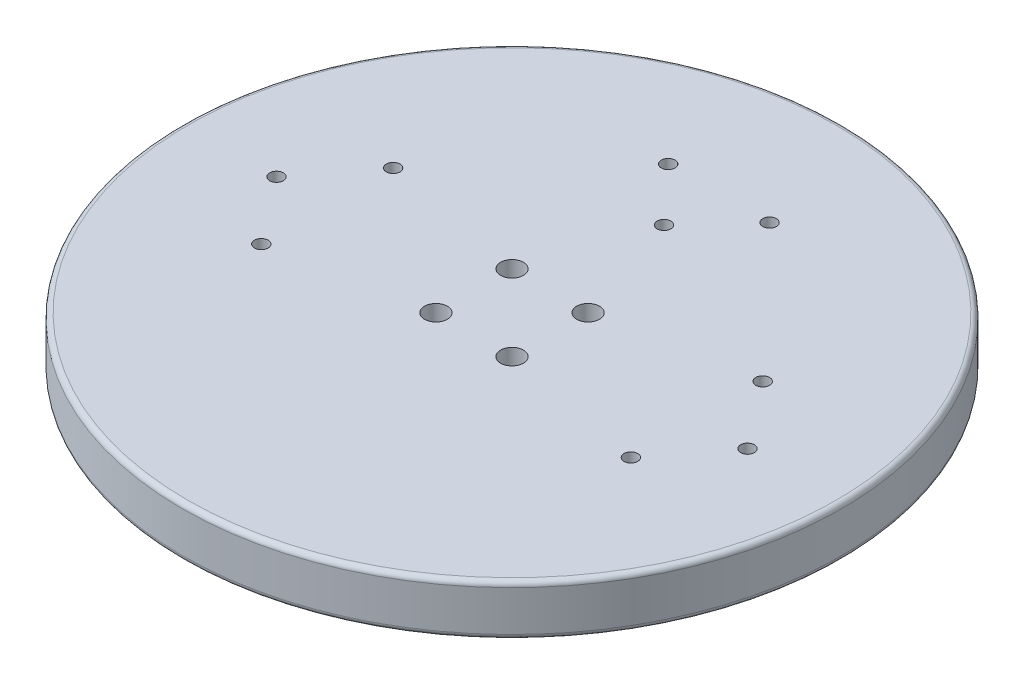
ISO-10303-21;
HEADER;
FILE_DESCRIPTION(('STEP AP214'),'2;1');
FILE_NAME('part.step','',(''),(''),'','','');
FILE_SCHEMA(('AUTOMOTIVE_DESIGN { 1 0 10303 214 1 1 1 1 }'));
ENDSEC;
DATA;
#1=APPLICATION_CONTEXT('core data for automotive mechanical design processes');
#2=APPLICATION_PROTOCOL_DEFINITION('international standard','automotive_design',2000,#1);
#3=PRODUCT_CONTEXT('',#1,'mechanical');
#4=PRODUCT('Part','Part','',(#3));
#5=PRODUCT_RELATED_PRODUCT_CATEGORY('part','',(#4));
#6=PRODUCT_DEFINITION_FORMATION('','',#4);
#7=PRODUCT_DEFINITION_CONTEXT('part definition',#1,'design');
#8=PRODUCT_DEFINITION('design','',#6,#7);
#9=PRODUCT_DEFINITION_SHAPE('','',#8);
#10=(LENGTH_UNIT() NAMED_UNIT(*) SI_UNIT(.MILLI.,.METRE.));
#11=(NAMED_UNIT(*) PLANE_ANGLE_UNIT() SI_UNIT($,.RADIAN.));
#12=(NAMED_UNIT(*) SI_UNIT($,.STERADIAN.) SOLID_ANGLE_UNIT());
#13=UNCERTAINTY_MEASURE_WITH_UNIT(LENGTH_MEASURE(1.E-05),#10,'distance_accuracy_value','');
#14=(GEOMETRIC_REPRESENTATION_CONTEXT(3) GLOBAL_UNCERTAINTY_ASSIGNED_CONTEXT((#13)) GLOBAL_UNIT_ASSIGNED_CONTEXT((#10,
#11,#12)) REPRESENTATION_CONTEXT('',''));
#15=CARTESIAN_POINT('',(0.,0.,0.));
#16=DIRECTION('',(0.,0.,1.));
#17=DIRECTION('',(1.,0.,0.));
#18=AXIS2_PLACEMENT_3D('',#15,#16,#17);
#19=CARTESIAN_POINT('',(0.,10.,0.));
#20=DIRECTION('',(0.,-1.,0.));
#21=DIRECTION('',(0.,0.,-1.));
#22=AXIS2_PLACEMENT_3D('',#19,#20,#21);
#23=CYLINDRICAL_SURFACE('',#22,65.);
#24=CARTESIAN_POINT('',(0.,0.999999999999999,0.));
#25=DIRECTION('',(0.,1.,0.));
#26=DIRECTION('',(0.,0.,1.));
#27=AXIS2_PLACEMENT_3D('',#24,#25,#26);
#28=CIRCLE('',#27,65.);
#29=CARTESIAN_POINT('',(0.,0.999999999999999,65.));
#30=VERTEX_POINT('',#29);
#31=EDGE_CURVE('E43',#30,#30,#28,.T.);
#32=ORIENTED_EDGE('',*,*,#31,.T.);
#33=EDGE_LOOP('',(#32));
#34=FACE_BOUND('',#33,.T.);
#35=CARTESIAN_POINT('',(0.,9.,0.));
#36=DIRECTION('',(0.,1.,0.));
#37=DIRECTION('',(0.,0.,1.));
#38=AXIS2_PLACEMENT_3D('',#35,#36,#37);
#39=CIRCLE('',#38,65.);
#40=CARTESIAN_POINT('',(0.,9.,65.));
#41=VERTEX_POINT('',#40);
#42=EDGE_CURVE('E47',#41,#41,#39,.F.);
#43=ORIENTED_EDGE('',*,*,#42,.T.);
#44=EDGE_LOOP('',(#43));
#45=FACE_BOUND('',#44,.T.);
#46=ADVANCED_FACE('F32',(#34,#45),#23,.T.);
#47=CARTESIAN_POINT('',(0.,10.,0.));
#48=DIRECTION('',(0.,1.,0.));
#49=DIRECTION('',(0.,0.,1.));
#50=AXIS2_PLACEMENT_3D('',#47,#48,#49);
#51=PLANE('',#50);
#52=CARTESIAN_POINT('',(-7.5,10.,7.5));
#53=DIRECTION('',(0.,-1.,0.));
#54=DIRECTION('',(0.,0.,-1.));
#55=AXIS2_PLACEMENT_3D('',#52,#53,#54);
#56=CIRCLE('',#55,2.2479);
#57=CARTESIAN_POINT('',(-7.5,10.,5.2521));
#58=VERTEX_POINT('',#57);
#59=EDGE_CURVE('E124',#58,#58,#56,.T.);
#60=ORIENTED_EDGE('',*,*,#59,.T.);
#61=EDGE_LOOP('',(#60));
#62=FACE_BOUND('',#61,.T.);
#63=CARTESIAN_POINT('',(7.5,10.,7.5));
#64=DIRECTION('',(0.,-1.,0.));
#65=DIRECTION('',(0.,0.,-1.));
#66=AXIS2_PLACEMENT_3D('',#63,#64,#65);
#67=CIRCLE('',#66,2.2479);
#68=CARTESIAN_POINT('',(7.5,10.,5.2521));
#69=VERTEX_POINT('',#68);
#70=EDGE_CURVE('E118',#69,#69,#67,.T.);
#71=ORIENTED_EDGE('',*,*,#70,.T.);
#72=EDGE_LOOP('',(#71));
#73=FACE_BOUND('',#72,.T.);
#74=CARTESIAN_POINT('',(-7.5,10.,-7.5));
#75=DIRECTION('',(0.,-1.,0.));
#76=DIRECTION('',(0.,0.,-1.));
#77=AXIS2_PLACEMENT_3D('',#74,#75,#76);
#78=CIRCLE('',#77,2.2479);
#79=CARTESIAN_POINT('',(-7.5,10.,-9.7479));
#80=VERTEX_POINT('',#79);
#81=EDGE_CURVE('E112',#80,#80,#78,.T.);
#82=ORIENTED_EDGE('',*,*,#81,.T.);
#83=EDGE_LOOP('',(#82));
#84=FACE_BOUND('',#83,.T.);
#85=CARTESIAN_POINT('',(7.5,10.,-7.5));
#86=DIRECTION('',(0.,-1.,0.));
#87=DIRECTION('',(0.,0.,-1.));
#88=AXIS2_PLACEMENT_3D('',#85,#86,#87);
#89=CIRCLE('',#88,2.2479);
#90=CARTESIAN_POINT('',(7.5,10.,-9.7479));
#91=VERTEX_POINT('',#90);
#92=EDGE_CURVE('E106',#91,#91,#89,.T.);
#93=ORIENTED_EDGE('',*,*,#92,.T.);
#94=EDGE_LOOP('',(#93));
#95=FACE_BOUND('',#94,.T.);
#96=CARTESIAN_POINT('',(-46.445,10.,0.));
#97=DIRECTION('',(0.,-1.,0.));
#98=DIRECTION('',(0.,0.,-1.));
#99=AXIS2_PLACEMENT_3D('',#96,#97,#98);
#100=CIRCLE('',#99,1.35254999999999);
#101=CARTESIAN_POINT('',(-46.445,10.,-1.35254999999999));
#102=VERTEX_POINT('',#101);
#103=EDGE_CURVE('E100',#102,#102,#100,.T.);
#104=ORIENTED_EDGE('',*,*,#103,.T.);
#105=EDGE_LOOP('',(#104));
#106=FACE_BOUND('',#105,.T.);
#107=CARTESIAN_POINT('',(46.445,10.,0.));
#108=DIRECTION('',(0.,-1.,0.));
#109=DIRECTION('',(0.,0.,-1.));
#110=AXIS2_PLACEMENT_3D('',#107,#108,#109);
#111=CIRCLE('',#110,1.35254999999999);
#112=CARTESIAN_POINT('',(46.445,10.,-1.35254999999999));
#113=VERTEX_POINT('',#112);
#114=EDGE_CURVE('E94',#113,#113,#111,.T.);
#115=ORIENTED_EDGE('',*,*,#114,.T.);
#116=EDGE_LOOP('',(#115));
#117=FACE_BOUND('',#116,.T.);
#118=CARTESIAN_POINT('',(-36.445,10.,-13.));
#119=DIRECTION('',(0.,-1.,0.));
#120=DIRECTION('',(0.,0.,-1.));
#121=AXIS2_PLACEMENT_3D('',#118,#119,#120);
#122=CIRCLE('',#121,1.35254999999999);
#123=CARTESIAN_POINT('',(-36.445,10.,-14.35255));
#124=VERTEX_POINT('',#123);
#125=EDGE_CURVE('E88',#124,#124,#122,.T.);
#126=ORIENTED_EDGE('',*,*,#125,.T.);
#127=EDGE_LOOP('',(#126));
#128=FACE_BOUND('',#127,.T.);
#129=CARTESIAN_POINT('',(-36.445,10.,13.));
#130=DIRECTION('',(0.,-1.,0.));
#131=DIRECTION('',(0.,0.,-1.));
#132=AXIS2_PLACEMENT_3D('',#129,#130,#131);
#133=CIRCLE('',#132,1.35254999999999);
#134=CARTESIAN_POINT('',(-36.445,10.,11.64745));
#135=VERTEX_POINT('',#134);
#136=EDGE_CURVE('E82',#135,#135,#133,.T.);
#137=ORIENTED_EDGE('',*,*,#136,.T.);
#138=EDGE_LOOP('',(#137));
#139=FACE_BOUND('',#138,.T.);
#140=CARTESIAN_POINT('',(36.445,10.,13.));
#141=DIRECTION('',(0.,-1.,0.));
#142=DIRECTION('',(0.,0.,-1.));
#143=AXIS2_PLACEMENT_3D('',#140,#141,#142);
#144=CIRCLE('',#143,1.35254999999999);
#145=CARTESIAN_POINT('',(36.445,10.,11.64745));
#146=VERTEX_POINT('',#145);
#147=EDGE_CURVE('E76',#146,#146,#144,.T.);
#148=ORIENTED_EDGE('',*,*,#147,.T.);
#149=EDGE_LOOP('',(#148));
#150=FACE_BOUND('',#149,.T.);
#151=CARTESIAN_POINT('',(36.445,10.,-13.));
#152=DIRECTION('',(0.,-1.,0.));
#153=DIRECTION('',(0.,0.,-1.));
#154=AXIS2_PLACEMENT_3D('',#151,#152,#153);
#155=CIRCLE('',#154,1.35254999999999);
#156=CARTESIAN_POINT('',(36.445,10.,-14.35255));
#157=VERTEX_POINT('',#156);
#158=EDGE_CURVE('E70',#157,#157,#155,.T.);
#159=ORIENTED_EDGE('',*,*,#158,.T.);
#160=EDGE_LOOP('',(#159));
#161=FACE_BOUND('',#160,.T.);
#162=CARTESIAN_POINT('',(10.0011944901924,10.,-40.8000000000147));
#163=DIRECTION('',(0.,-1.,0.));
#164=DIRECTION('',(0.,0.,-1.));
#165=AXIS2_PLACEMENT_3D('',#162,#163,#164);
#166=CIRCLE('',#165,1.35255);
#167=CARTESIAN_POINT('',(10.0011944901924,10.,-42.1525500000146));
#168=VERTEX_POINT('',#167);
#169=EDGE_CURVE('E64',#168,#168,#166,.T.);
#170=ORIENTED_EDGE('',*,*,#169,.T.);
#171=EDGE_LOOP('',(#170));
#172=FACE_BOUND('',#171,.T.);
#173=CARTESIAN_POINT('',(0.00119449019234531,10.,-29.9780972451109));
#174=DIRECTION('',(0.,-1.,0.));
#175=DIRECTION('',(0.,0.,-1.));
#176=AXIS2_PLACEMENT_3D('',#173,#174,#175);
#177=CIRCLE('',#176,1.35255);
#178=CARTESIAN_POINT('',(0.00119449019234531,10.,-31.3306472451109));
#179=VERTEX_POINT('',#178);
#180=EDGE_CURVE('E58',#179,#179,#177,.T.);
#181=ORIENTED_EDGE('',*,*,#180,.T.);
#182=EDGE_LOOP('',(#181));
#183=FACE_BOUND('',#182,.T.);
#184=CARTESIAN_POINT('',(-9.9988055098076,10.,-40.8000000000147));
#185=DIRECTION('',(0.,-1.,0.));
#186=DIRECTION('',(0.,0.,-1.));
#187=AXIS2_PLACEMENT_3D('',#184,#185,#186);
#188=CIRCLE('',#187,1.35255);
#189=CARTESIAN_POINT('',(-9.9988055098076,10.,-42.1525500000147));
#190=VERTEX_POINT('',#189);
#191=EDGE_CURVE('E52',#190,#190,#188,.T.);
#192=ORIENTED_EDGE('',*,*,#191,.T.);
#193=EDGE_LOOP('',(#192));
#194=FACE_BOUND('',#193,.T.);
#195=CARTESIAN_POINT('',(0.,10.,0.));
#196=DIRECTION('',(0.,1.,0.));
#197=DIRECTION('',(0.,0.,1.));
#198=AXIS2_PLACEMENT_3D('',#195,#196,#197);
#199=CIRCLE('',#198,64.);
#200=CARTESIAN_POINT('',(0.,10.,64.));
#201=VERTEX_POINT('',#200);
#202=EDGE_CURVE('E10',#201,#201,#199,.T.);
#203=ORIENTED_EDGE('',*,*,#202,.T.);
#204=EDGE_LOOP('',(#203));
#205=FACE_BOUND('',#204,.T.);
#206=ADVANCED_FACE('F137',(#62,#73,#84,#95,#106,#117,#128,#139,#150,#161,#172,#183,#194,#205),
#51,.T.);
#207=CARTESIAN_POINT('',(0.,0.,0.));
#208=DIRECTION('',(0.,1.,0.));
#209=DIRECTION('',(0.,0.,1.));
#210=AXIS2_PLACEMENT_3D('',#207,#208,#209);
#211=PLANE('',#210);
#212=CARTESIAN_POINT('',(-7.5,0.,7.5));
#213=DIRECTION('',(0.,-1.,0.));
#214=DIRECTION('',(0.,0.,-1.));
#215=AXIS2_PLACEMENT_3D('',#212,#213,#214);
#216=CIRCLE('',#215,2.2479);
#217=CARTESIAN_POINT('',(-7.5,0.,5.2521));
#218=VERTEX_POINT('',#217);
#219=EDGE_CURVE('E127',#218,#218,#216,.T.);
#220=ORIENTED_EDGE('',*,*,#219,.F.);
#221=EDGE_LOOP('',(#220));
#222=FACE_BOUND('',#221,.T.);
#223=CARTESIAN_POINT('',(7.5,0.,7.5));
#224=DIRECTION('',(0.,-1.,0.));
#225=DIRECTION('',(0.,0.,-1.));
#226=AXIS2_PLACEMENT_3D('',#223,#224,#225);
#227=CIRCLE('',#226,2.2479);
#228=CARTESIAN_POINT('',(7.5,0.,5.2521));
#229=VERTEX_POINT('',#228);
#230=EDGE_CURVE('E121',#229,#229,#227,.T.);
#231=ORIENTED_EDGE('',*,*,#230,.F.);
#232=EDGE_LOOP('',(#231));
#233=FACE_BOUND('',#232,.T.);
#234=CARTESIAN_POINT('',(-7.5,0.,-7.5));
#235=DIRECTION('',(0.,-1.,0.));
#236=DIRECTION('',(0.,0.,-1.));
#237=AXIS2_PLACEMENT_3D('',#234,#235,#236);
#238=CIRCLE('',#237,2.2479);
#239=CARTESIAN_POINT('',(-7.5,0.,-9.7479));
#240=VERTEX_POINT('',#239);
#241=EDGE_CURVE('E115',#240,#240,#238,.T.);
#242=ORIENTED_EDGE('',*,*,#241,.F.);
#243=EDGE_LOOP('',(#242));
#244=FACE_BOUND('',#243,.T.);
#245=CARTESIAN_POINT('',(7.5,0.,-7.5));
#246=DIRECTION('',(0.,-1.,0.));
#247=DIRECTION('',(0.,0.,-1.));
#248=AXIS2_PLACEMENT_3D('',#245,#246,#247);
#249=CIRCLE('',#248,2.2479);
#250=CARTESIAN_POINT('',(7.5,0.,-9.7479));
#251=VERTEX_POINT('',#250);
#252=EDGE_CURVE('E109',#251,#251,#249,.T.);
#253=ORIENTED_EDGE('',*,*,#252,.F.);
#254=EDGE_LOOP('',(#253));
#255=FACE_BOUND('',#254,.T.);
#256=CARTESIAN_POINT('',(-46.445,0.,0.));
#257=DIRECTION('',(0.,-1.,0.));
#258=DIRECTION('',(0.,0.,-1.));
#259=AXIS2_PLACEMENT_3D('',#256,#257,#258);
#260=CIRCLE('',#259,1.35255);
#261=CARTESIAN_POINT('',(-46.445,0.,-1.35255));
#262=VERTEX_POINT('',#261);
#263=EDGE_CURVE('E103',#262,#262,#260,.T.);
#264=ORIENTED_EDGE('',*,*,#263,.F.);
#265=EDGE_LOOP('',(#264));
#266=FACE_BOUND('',#265,.T.);
#267=CARTESIAN_POINT('',(46.445,0.,0.));
#268=DIRECTION('',(0.,-1.,0.));
#269=DIRECTION('',(0.,0.,-1.));
#270=AXIS2_PLACEMENT_3D('',#267,#268,#269);
#271=CIRCLE('',#270,1.35255);
#272=CARTESIAN_POINT('',(46.445,0.,-1.35255));
#273=VERTEX_POINT('',#272);
#274=EDGE_CURVE('E97',#273,#273,#271,.T.);
#275=ORIENTED_EDGE('',*,*,#274,.F.);
#276=EDGE_LOOP('',(#275));
#277=FACE_BOUND('',#276,.T.);
#278=CARTESIAN_POINT('',(-36.445,0.,-13.));
#279=DIRECTION('',(0.,-1.,0.));
#280=DIRECTION('',(0.,0.,-1.));
#281=AXIS2_PLACEMENT_3D('',#278,#279,#280);
#282=CIRCLE('',#281,1.35255);
#283=CARTESIAN_POINT('',(-36.445,0.,-14.35255));
#284=VERTEX_POINT('',#283);
#285=EDGE_CURVE('E91',#284,#284,#282,.T.);
#286=ORIENTED_EDGE('',*,*,#285,.F.);
#287=EDGE_LOOP('',(#286));
#288=FACE_BOUND('',#287,.T.);
#289=CARTESIAN_POINT('',(-36.445,0.,13.));
#290=DIRECTION('',(0.,-1.,0.));
#291=DIRECTION('',(0.,0.,-1.));
#292=AXIS2_PLACEMENT_3D('',#289,#290,#291);
#293=CIRCLE('',#292,1.35255);
#294=CARTESIAN_POINT('',(-36.445,0.,11.64745));
#295=VERTEX_POINT('',#294);
#296=EDGE_CURVE('E85',#295,#295,#293,.T.);
#297=ORIENTED_EDGE('',*,*,#296,.F.);
#298=EDGE_LOOP('',(#297));
#299=FACE_BOUND('',#298,.T.);
#300=CARTESIAN_POINT('',(36.445,0.,13.));
#301=DIRECTION('',(0.,-1.,0.));
#302=DIRECTION('',(0.,0.,-1.));
#303=AXIS2_PLACEMENT_3D('',#300,#301,#302);
#304=CIRCLE('',#303,1.35255);
#305=CARTESIAN_POINT('',(36.445,0.,11.64745));
#306=VERTEX_POINT('',#305);
#307=EDGE_CURVE('E79',#306,#306,#304,.T.);
#308=ORIENTED_EDGE('',*,*,#307,.F.);
#309=EDGE_LOOP('',(#308));
#310=FACE_BOUND('',#309,.T.);
#311=CARTESIAN_POINT('',(36.445,0.,-13.));
#312=DIRECTION('',(0.,-1.,0.));
#313=DIRECTION('',(0.,0.,-1.));
#314=AXIS2_PLACEMENT_3D('',#311,#312,#313);
#315=CIRCLE('',#314,1.35255);
#316=CARTESIAN_POINT('',(36.445,0.,-14.35255));
#317=VERTEX_POINT('',#316);
#318=EDGE_CURVE('E73',#317,#317,#315,.T.);
#319=ORIENTED_EDGE('',*,*,#318,.F.);
#320=EDGE_LOOP('',(#319));
#321=FACE_BOUND('',#320,.T.);
#322=CARTESIAN_POINT('',(10.0011944901924,0.,-40.8000000000147));
#323=DIRECTION('',(0.,-1.,0.));
#324=DIRECTION('',(0.,0.,-1.));
#325=AXIS2_PLACEMENT_3D('',#322,#323,#324);
#326=CIRCLE('',#325,1.35255);
#327=CARTESIAN_POINT('',(10.0011944901924,0.,-42.1525500000147));
#328=VERTEX_POINT('',#327);
#329=EDGE_CURVE('E67',#328,#328,#326,.T.);
#330=ORIENTED_EDGE('',*,*,#329,.F.);
#331=EDGE_LOOP('',(#330));
#332=FACE_BOUND('',#331,.T.);
#333=CARTESIAN_POINT('',(0.00119449019234531,0.,-29.9780972451109));
#334=DIRECTION('',(0.,-1.,0.));
#335=DIRECTION('',(0.,0.,-1.));
#336=AXIS2_PLACEMENT_3D('',#333,#334,#335);
#337=CIRCLE('',#336,1.35255);
#338=CARTESIAN_POINT('',(0.00119449019234531,0.,-31.3306472451109));
#339=VERTEX_POINT('',#338);
#340=EDGE_CURVE('E61',#339,#339,#337,.T.);
#341=ORIENTED_EDGE('',*,*,#340,.F.);
#342=EDGE_LOOP('',(#341));
#343=FACE_BOUND('',#342,.T.);
#344=CARTESIAN_POINT('',(-9.9988055098076,0.,-40.8000000000147));
#345=DIRECTION('',(0.,-1.,0.));
#346=DIRECTION('',(0.,0.,-1.));
#347=AXIS2_PLACEMENT_3D('',#344,#345,#346);
#348=CIRCLE('',#347,1.35255);
#349=CARTESIAN_POINT('',(-9.9988055098076,0.,-42.1525500000147));
#350=VERTEX_POINT('',#349);
#351=EDGE_CURVE('E55',#350,#350,#348,.T.);
#352=ORIENTED_EDGE('',*,*,#351,.F.);
#353=EDGE_LOOP('',(#352));
#354=FACE_BOUND('',#353,.T.);
#355=CARTESIAN_POINT('',(0.,0.,0.));
#356=DIRECTION('',(0.,1.,0.));
#357=DIRECTION('',(0.,0.,1.));
#358=AXIS2_PLACEMENT_3D('',#355,#356,#357);
#359=CIRCLE('',#358,64.);
#360=CARTESIAN_POINT('',(0.,0.,64.));
#361=VERTEX_POINT('',#360);
#362=EDGE_CURVE('E39',#361,#361,#359,.F.);
#363=ORIENTED_EDGE('',*,*,#362,.T.);
#364=EDGE_LOOP('',(#363));
#365=FACE_BOUND('',#364,.T.);
#366=ADVANCED_FACE('F133',(#222,#233,#244,#255,#266,#277,#288,#299,#310,#321,#332,#343,#354,
#365),#211,.F.);
#367=CARTESIAN_POINT('',(0.,0.999999999999999,0.));
#368=DIRECTION('',(0.,1.,0.));
#369=DIRECTION('',(0.,0.,1.));
#370=AXIS2_PLACEMENT_3D('',#367,#368,#369);
#371=TOROIDAL_SURFACE('',#370,64.,1.);
#372=ORIENTED_EDGE('',*,*,#362,.F.);
#373=EDGE_LOOP('',(#372));
#374=FACE_BOUND('',#373,.T.);
#375=ORIENTED_EDGE('',*,*,#31,.F.);
#376=EDGE_LOOP('',(#375));
#377=FACE_BOUND('',#376,.T.);
#378=ADVANCED_FACE('F136',(#374,#377),#371,.T.);
#379=CARTESIAN_POINT('',(0.,9.,0.));
#380=DIRECTION('',(0.,1.,0.));
#381=DIRECTION('',(0.,0.,1.));
#382=AXIS2_PLACEMENT_3D('',#379,#380,#381);
#383=TOROIDAL_SURFACE('',#382,64.,1.);
#384=ORIENTED_EDGE('',*,*,#42,.F.);
#385=EDGE_LOOP('',(#384));
#386=FACE_BOUND('',#385,.T.);
#387=ORIENTED_EDGE('',*,*,#202,.F.);
#388=EDGE_LOOP('',(#387));
#389=FACE_BOUND('',#388,.T.);
#390=ADVANCED_FACE('F34',(#386,#389),#383,.T.);
#391=CARTESIAN_POINT('',(-9.9988055098076,0.,-40.8000000000147));
#392=DIRECTION('',(0.,-1.,0.));
#393=DIRECTION('',(0.,0.,-1.));
#394=AXIS2_PLACEMENT_3D('',#391,#392,#393);
#395=CYLINDRICAL_SURFACE('',#394,1.35255);
#396=ORIENTED_EDGE('',*,*,#191,.F.);
#397=EDGE_LOOP('',(#396));
#398=FACE_BOUND('',#397,.T.);
#399=ORIENTED_EDGE('',*,*,#351,.T.);
#400=EDGE_LOOP('',(#399));
#401=FACE_BOUND('',#400,.T.);
#402=ADVANCED_FACE('F163',(#398,#401),#395,.F.);
#403=CARTESIAN_POINT('',(0.00119449019234531,0.,-29.9780972451109));
#404=DIRECTION('',(0.,-1.,0.));
#405=DIRECTION('',(0.,0.,-1.));
#406=AXIS2_PLACEMENT_3D('',#403,#404,#405);
#407=CYLINDRICAL_SURFACE('',#406,1.35255);
#408=ORIENTED_EDGE('',*,*,#180,.F.);
#409=EDGE_LOOP('',(#408));
#410=FACE_BOUND('',#409,.T.);
#411=ORIENTED_EDGE('',*,*,#340,.T.);
#412=EDGE_LOOP('',(#411));
#413=FACE_BOUND('',#412,.T.);
#414=ADVANCED_FACE('F165',(#410,#413),#407,.F.);
#415=CARTESIAN_POINT('',(10.0011944901924,0.,-40.8000000000147));
#416=DIRECTION('',(0.,-1.,0.));
#417=DIRECTION('',(0.,0.,-1.));
#418=AXIS2_PLACEMENT_3D('',#415,#416,#417);
#419=CYLINDRICAL_SURFACE('',#418,1.35255);
#420=ORIENTED_EDGE('',*,*,#169,.F.);
#421=EDGE_LOOP('',(#420));
#422=FACE_BOUND('',#421,.T.);
#423=ORIENTED_EDGE('',*,*,#329,.T.);
#424=EDGE_LOOP('',(#423));
#425=FACE_BOUND('',#424,.T.);
#426=ADVANCED_FACE('F172',(#422,#425),#419,.F.);
#427=CARTESIAN_POINT('',(36.445,0.,-13.));
#428=DIRECTION('',(0.,-1.,0.));
#429=DIRECTION('',(0.,0.,-1.));
#430=AXIS2_PLACEMENT_3D('',#427,#428,#429);
#431=CYLINDRICAL_SURFACE('',#430,1.35255);
#432=ORIENTED_EDGE('',*,*,#158,.F.);
#433=EDGE_LOOP('',(#432));
#434=FACE_BOUND('',#433,.T.);
#435=ORIENTED_EDGE('',*,*,#318,.T.);
#436=EDGE_LOOP('',(#435));
#437=FACE_BOUND('',#436,.T.);
#438=ADVANCED_FACE('F222',(#434,#437),#431,.F.);
#439=CARTESIAN_POINT('',(36.445,0.,13.));
#440=DIRECTION('',(0.,-1.,0.));
#441=DIRECTION('',(0.,0.,-1.));
#442=AXIS2_PLACEMENT_3D('',#439,#440,#441);
#443=CYLINDRICAL_SURFACE('',#442,1.35255);
#444=ORIENTED_EDGE('',*,*,#147,.F.);
#445=EDGE_LOOP('',(#444));
#446=FACE_BOUND('',#445,.T.);
#447=ORIENTED_EDGE('',*,*,#307,.T.);
#448=EDGE_LOOP('',(#447));
#449=FACE_BOUND('',#448,.T.);
#450=ADVANCED_FACE('F232',(#446,#449),#443,.F.);
#451=CARTESIAN_POINT('',(-36.445,0.,13.));
#452=DIRECTION('',(0.,-1.,0.));
#453=DIRECTION('',(0.,0.,-1.));
#454=AXIS2_PLACEMENT_3D('',#451,#452,#453);
#455=CYLINDRICAL_SURFACE('',#454,1.35255);
#456=ORIENTED_EDGE('',*,*,#136,.F.);
#457=EDGE_LOOP('',(#456));
#458=FACE_BOUND('',#457,.T.);
#459=ORIENTED_EDGE('',*,*,#296,.T.);
#460=EDGE_LOOP('',(#459));
#461=FACE_BOUND('',#460,.T.);
#462=ADVANCED_FACE('F243',(#458,#461),#455,.F.);
#463=CARTESIAN_POINT('',(-36.445,0.,-13.));
#464=DIRECTION('',(0.,-1.,0.));
#465=DIRECTION('',(0.,0.,-1.));
#466=AXIS2_PLACEMENT_3D('',#463,#464,#465);
#467=CYLINDRICAL_SURFACE('',#466,1.35255);
#468=ORIENTED_EDGE('',*,*,#125,.F.);
#469=EDGE_LOOP('',(#468));
#470=FACE_BOUND('',#469,.T.);
#471=ORIENTED_EDGE('',*,*,#285,.T.);
#472=EDGE_LOOP('',(#471));
#473=FACE_BOUND('',#472,.T.);
#474=ADVANCED_FACE('F254',(#470,#473),#467,.F.);
#475=CARTESIAN_POINT('',(46.445,0.,0.));
#476=DIRECTION('',(0.,-1.,0.));
#477=DIRECTION('',(0.,0.,-1.));
#478=AXIS2_PLACEMENT_3D('',#475,#476,#477);
#479=CYLINDRICAL_SURFACE('',#478,1.35255);
#480=ORIENTED_EDGE('',*,*,#114,.F.);
#481=EDGE_LOOP('',(#480));
#482=FACE_BOUND('',#481,.T.);
#483=ORIENTED_EDGE('',*,*,#274,.T.);
#484=EDGE_LOOP('',(#483));
#485=FACE_BOUND('',#484,.T.);
#486=ADVANCED_FACE('F265',(#482,#485),#479,.F.);
#487=CARTESIAN_POINT('',(-46.445,0.,0.));
#488=DIRECTION('',(0.,-1.,0.));
#489=DIRECTION('',(0.,0.,-1.));
#490=AXIS2_PLACEMENT_3D('',#487,#488,#489);
#491=CYLINDRICAL_SURFACE('',#490,1.35255);
#492=ORIENTED_EDGE('',*,*,#103,.F.);
#493=EDGE_LOOP('',(#492));
#494=FACE_BOUND('',#493,.T.);
#495=ORIENTED_EDGE('',*,*,#263,.T.);
#496=EDGE_LOOP('',(#495));
#497=FACE_BOUND('',#496,.T.);
#498=ADVANCED_FACE('F276',(#494,#497),#491,.F.);
#499=CARTESIAN_POINT('',(7.5,0.,-7.5));
#500=DIRECTION('',(0.,-1.,0.));
#501=DIRECTION('',(0.,0.,-1.));
#502=AXIS2_PLACEMENT_3D('',#499,#500,#501);
#503=CYLINDRICAL_SURFACE('',#502,2.2479);
#504=ORIENTED_EDGE('',*,*,#92,.F.);
#505=EDGE_LOOP('',(#504));
#506=FACE_BOUND('',#505,.T.);
#507=ORIENTED_EDGE('',*,*,#252,.T.);
#508=EDGE_LOOP('',(#507));
#509=FACE_BOUND('',#508,.T.);
#510=ADVANCED_FACE('F287',(#506,#509),#503,.F.);
#511=CARTESIAN_POINT('',(-7.5,0.,-7.5));
#512=DIRECTION('',(0.,-1.,0.));
#513=DIRECTION('',(0.,0.,-1.));
#514=AXIS2_PLACEMENT_3D('',#511,#512,#513);
#515=CYLINDRICAL_SURFACE('',#514,2.2479);
#516=ORIENTED_EDGE('',*,*,#81,.F.);
#517=EDGE_LOOP('',(#516));
#518=FACE_BOUND('',#517,.T.);
#519=ORIENTED_EDGE('',*,*,#241,.T.);
#520=EDGE_LOOP('',(#519));
#521=FACE_BOUND('',#520,.T.);
#522=ADVANCED_FACE('F308',(#518,#521),#515,.F.);
#523=CARTESIAN_POINT('',(7.5,0.,7.5));
#524=DIRECTION('',(0.,-1.,0.));
#525=DIRECTION('',(0.,0.,-1.));
#526=AXIS2_PLACEMENT_3D('',#523,#524,#525);
#527=CYLINDRICAL_SURFACE('',#526,2.2479);
#528=ORIENTED_EDGE('',*,*,#70,.F.);
#529=EDGE_LOOP('',(#528));
#530=FACE_BOUND('',#529,.T.);
#531=ORIENTED_EDGE('',*,*,#230,.T.);
#532=EDGE_LOOP('',(#531));
#533=FACE_BOUND('',#532,.T.);
#534=ADVANCED_FACE('F318',(#530,#533),#527,.F.);
#535=CARTESIAN_POINT('',(-7.5,0.,7.5));
#536=DIRECTION('',(0.,-1.,0.));
#537=DIRECTION('',(0.,0.,-1.));
#538=AXIS2_PLACEMENT_3D('',#535,#536,#537);
#539=CYLINDRICAL_SURFACE('',#538,2.2479);
#540=ORIENTED_EDGE('',*,*,#59,.F.);
#541=EDGE_LOOP('',(#540));
#542=FACE_BOUND('',#541,.T.);
#543=ORIENTED_EDGE('',*,*,#219,.T.);
#544=EDGE_LOOP('',(#543));
#545=FACE_BOUND('',#544,.T.);
#546=ADVANCED_FACE('F131',(#542,#545),#539,.F.);
#547=CLOSED_SHELL('',(#46,#206,#366,#378,#390,#402,#414,#426,#438,#450,#462,#474,#486,#498,#510,
#522,#534,#546));
#548=MANIFOLD_SOLID_BREP('B2',#547);
#549=ADVANCED_BREP_SHAPE_REPRESENTATION('',(#18,#548),#14);
#550=SHAPE_DEFINITION_REPRESENTATION(#9,#549);
ENDSEC;
END-ISO-10303-21;
